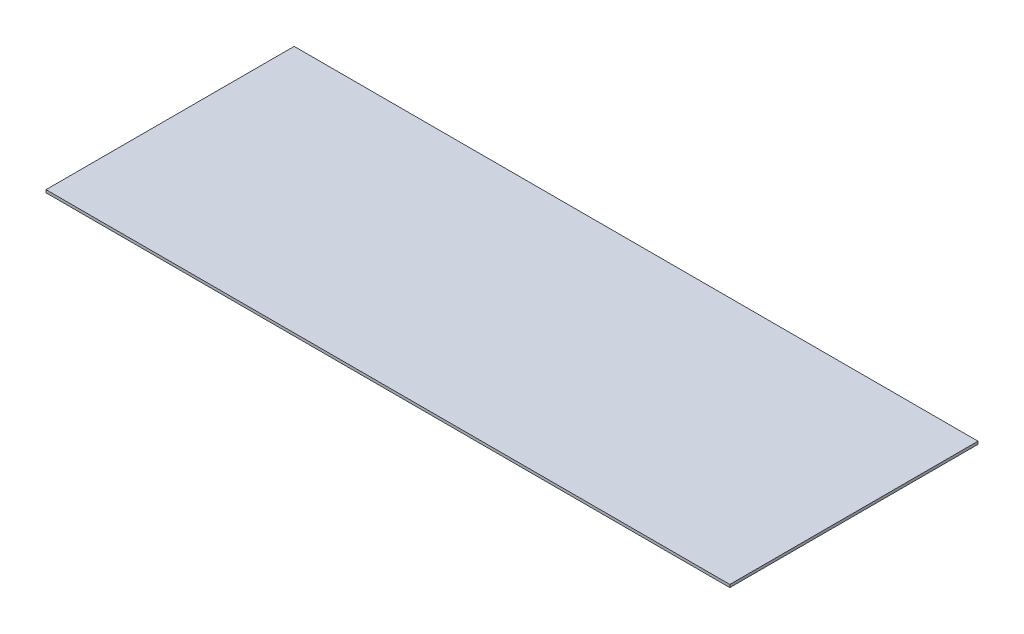
ISO-10303-21;
HEADER;
FILE_DESCRIPTION(('STEP AP214'),'2;1');
FILE_NAME('part.step','',(''),(''),'','','');
FILE_SCHEMA(('AUTOMOTIVE_DESIGN { 1 0 10303 214 1 1 1 1 }'));
ENDSEC;
DATA;
#1=APPLICATION_CONTEXT('core data for automotive mechanical design processes');
#2=APPLICATION_PROTOCOL_DEFINITION('international standard','automotive_design',2000,#1);
#3=PRODUCT_CONTEXT('',#1,'mechanical');
#4=PRODUCT('Part','Part','',(#3));
#5=PRODUCT_RELATED_PRODUCT_CATEGORY('part','',(#4));
#6=PRODUCT_DEFINITION_FORMATION('','',#4);
#7=PRODUCT_DEFINITION_CONTEXT('part definition',#1,'design');
#8=PRODUCT_DEFINITION('design','',#6,#7);
#9=PRODUCT_DEFINITION_SHAPE('','',#8);
#10=(LENGTH_UNIT() NAMED_UNIT(*) SI_UNIT(.MILLI.,.METRE.));
#11=(NAMED_UNIT(*) PLANE_ANGLE_UNIT() SI_UNIT($,.RADIAN.));
#12=(NAMED_UNIT(*) SI_UNIT($,.STERADIAN.) SOLID_ANGLE_UNIT());
#13=UNCERTAINTY_MEASURE_WITH_UNIT(LENGTH_MEASURE(1.E-05),#10,'distance_accuracy_value','');
#14=(GEOMETRIC_REPRESENTATION_CONTEXT(3) GLOBAL_UNCERTAINTY_ASSIGNED_CONTEXT((#13)) GLOBAL_UNIT_ASSIGNED_CONTEXT((#10,
#11,#12)) REPRESENTATION_CONTEXT('',''));
#15=CARTESIAN_POINT('',(0.,0.,0.));
#16=DIRECTION('',(0.,0.,1.));
#17=DIRECTION('',(1.,0.,0.));
#18=AXIS2_PLACEMENT_3D('',#15,#16,#17);
#19=CARTESIAN_POINT('',(-256.013393359467,248.,90.));
#20=DIRECTION('',(0.,1.,0.));
#21=DIRECTION('',(0.,0.,1.));
#22=AXIS2_PLACEMENT_3D('',#19,#20,#21);
#23=PLANE('',#22);
#24=DIRECTION('',(1.,0.,0.));
#25=VECTOR('',#24,1.);
#26=CARTESIAN_POINT('',(-250.,248.,90.));
#27=LINE('',#26,#25);
#28=CARTESIAN_POINT('',(-248.,248.,90.));
#29=VERTEX_POINT('',#28);
#30=CARTESIAN_POINT('',(248.,248.,90.));
#31=VERTEX_POINT('',#30);
#32=EDGE_CURVE('E86',#29,#31,#27,.T.);
#33=ORIENTED_EDGE('',*,*,#32,.F.);
#34=DIRECTION('',(0.,0.,1.));
#35=VECTOR('',#34,1.);
#36=CARTESIAN_POINT('',(-248.,248.,0.));
#37=LINE('',#36,#35);
#38=CARTESIAN_POINT('',(-248.,248.,-90.));
#39=VERTEX_POINT('',#38);
#40=EDGE_CURVE('E41',#39,#29,#37,.T.);
#41=ORIENTED_EDGE('',*,*,#40,.F.);
#42=DIRECTION('',(-1.,0.,0.));
#43=VECTOR('',#42,1.);
#44=CARTESIAN_POINT('',(-250.,248.,-90.));
#45=LINE('',#44,#43);
#46=CARTESIAN_POINT('',(248.,248.,-90.));
#47=VERTEX_POINT('',#46);
#48=EDGE_CURVE('E83',#47,#39,#45,.T.);
#49=ORIENTED_EDGE('',*,*,#48,.F.);
#50=DIRECTION('',(0.,0.,-1.));
#51=VECTOR('',#50,1.);
#52=CARTESIAN_POINT('',(248.,248.,0.));
#53=LINE('',#52,#51);
#54=EDGE_CURVE('E11',#31,#47,#53,.T.);
#55=ORIENTED_EDGE('',*,*,#54,.F.);
#56=EDGE_LOOP('',(#33,#41,#49,#55));
#57=FACE_BOUND('',#56,.T.);
#58=ADVANCED_FACE('F32',(#57),#23,.F.);
#59=CARTESIAN_POINT('',(0.,250.,0.));
#60=DIRECTION('',(0.,-1.,0.));
#61=DIRECTION('',(0.,0.,-1.));
#62=AXIS2_PLACEMENT_3D('',#59,#60,#61);
#63=PLANE('',#62);
#64=DIRECTION('',(-1.,0.,0.));
#65=VECTOR('',#64,1.);
#66=CARTESIAN_POINT('',(-250.,250.,-90.));
#67=LINE('',#66,#65);
#68=CARTESIAN_POINT('',(248.,250.,-90.));
#69=VERTEX_POINT('',#68);
#70=CARTESIAN_POINT('',(-248.,250.,-90.));
#71=VERTEX_POINT('',#70);
#72=EDGE_CURVE('E89',#69,#71,#67,.T.);
#73=ORIENTED_EDGE('',*,*,#72,.T.);
#74=DIRECTION('',(0.,0.,1.));
#75=VECTOR('',#74,1.);
#76=CARTESIAN_POINT('',(-248.,250.,0.));
#77=LINE('',#76,#75);
#78=CARTESIAN_POINT('',(-248.,250.,90.));
#79=VERTEX_POINT('',#78);
#80=EDGE_CURVE('E56',#71,#79,#77,.T.);
#81=ORIENTED_EDGE('',*,*,#80,.T.);
#82=DIRECTION('',(1.,0.,0.));
#83=VECTOR('',#82,1.);
#84=CARTESIAN_POINT('',(-250.,250.,90.));
#85=LINE('',#84,#83);
#86=CARTESIAN_POINT('',(248.,250.,90.));
#87=VERTEX_POINT('',#86);
#88=EDGE_CURVE('E99',#79,#87,#85,.T.);
#89=ORIENTED_EDGE('',*,*,#88,.T.);
#90=DIRECTION('',(0.,0.,-1.));
#91=VECTOR('',#90,1.);
#92=CARTESIAN_POINT('',(248.,250.,0.));
#93=LINE('',#92,#91);
#94=EDGE_CURVE('E98',#87,#69,#93,.T.);
#95=ORIENTED_EDGE('',*,*,#94,.T.);
#96=EDGE_LOOP('',(#73,#81,#89,#95));
#97=FACE_BOUND('',#96,.T.);
#98=ADVANCED_FACE('F106',(#97),#63,.F.);
#99=CARTESIAN_POINT('',(248.,250.,-133.832293437024));
#100=DIRECTION('',(-1.,0.,0.));
#101=DIRECTION('',(0.,0.,1.));
#102=AXIS2_PLACEMENT_3D('',#99,#100,#101);
#103=PLANE('',#102);
#104=DIRECTION('',(0.,1.,0.));
#105=VECTOR('',#104,1.);
#106=CARTESIAN_POINT('',(248.,250.,90.));
#107=LINE('',#106,#105);
#108=EDGE_CURVE('E36',#31,#87,#107,.T.);
#109=ORIENTED_EDGE('',*,*,#108,.F.);
#110=ORIENTED_EDGE('',*,*,#54,.T.);
#111=DIRECTION('',(0.,-1.,0.));
#112=VECTOR('',#111,1.);
#113=CARTESIAN_POINT('',(248.,250.,-90.));
#114=LINE('',#113,#112);
#115=EDGE_CURVE('E78',#69,#47,#114,.T.);
#116=ORIENTED_EDGE('',*,*,#115,.F.);
#117=ORIENTED_EDGE('',*,*,#94,.F.);
#118=EDGE_LOOP('',(#109,#110,#116,#117));
#119=FACE_BOUND('',#118,.T.);
#120=ADVANCED_FACE('F76',(#119),#103,.F.);
#121=CARTESIAN_POINT('',(-248.,250.,-133.832293437024));
#122=DIRECTION('',(1.,0.,0.));
#123=DIRECTION('',(0.,0.,-1.));
#124=AXIS2_PLACEMENT_3D('',#121,#122,#123);
#125=PLANE('',#124);
#126=DIRECTION('',(0.,1.,0.));
#127=VECTOR('',#126,1.);
#128=CARTESIAN_POINT('',(-248.,250.,-90.));
#129=LINE('',#128,#127);
#130=EDGE_CURVE('E90',#39,#71,#129,.T.);
#131=ORIENTED_EDGE('',*,*,#130,.F.);
#132=ORIENTED_EDGE('',*,*,#40,.T.);
#133=DIRECTION('',(0.,-1.,0.));
#134=VECTOR('',#133,1.);
#135=CARTESIAN_POINT('',(-248.,250.,90.));
#136=LINE('',#135,#134);
#137=EDGE_CURVE('E91',#79,#29,#136,.T.);
#138=ORIENTED_EDGE('',*,*,#137,.F.);
#139=ORIENTED_EDGE('',*,*,#80,.F.);
#140=EDGE_LOOP('',(#131,#132,#138,#139));
#141=FACE_BOUND('',#140,.T.);
#142=ADVANCED_FACE('F104',(#141),#125,.F.);
#143=CARTESIAN_POINT('',(-250.,250.,90.));
#144=DIRECTION('',(0.,0.,-1.));
#145=DIRECTION('',(-1.,0.,0.));
#146=AXIS2_PLACEMENT_3D('',#143,#144,#145);
#147=PLANE('',#146);
#148=ORIENTED_EDGE('',*,*,#137,.T.);
#149=ORIENTED_EDGE('',*,*,#32,.T.);
#150=ORIENTED_EDGE('',*,*,#108,.T.);
#151=ORIENTED_EDGE('',*,*,#88,.F.);
#152=EDGE_LOOP('',(#148,#149,#150,#151));
#153=FACE_BOUND('',#152,.T.);
#154=ADVANCED_FACE('F105',(#153),#147,.F.);
#155=CARTESIAN_POINT('',(-250.,250.,-90.));
#156=DIRECTION('',(0.,0.,1.));
#157=DIRECTION('',(1.,0.,0.));
#158=AXIS2_PLACEMENT_3D('',#155,#156,#157);
#159=PLANE('',#158);
#160=ORIENTED_EDGE('',*,*,#115,.T.);
#161=ORIENTED_EDGE('',*,*,#48,.T.);
#162=ORIENTED_EDGE('',*,*,#130,.T.);
#163=ORIENTED_EDGE('',*,*,#72,.F.);
#164=EDGE_LOOP('',(#160,#161,#162,#163));
#165=FACE_BOUND('',#164,.T.);
#166=ADVANCED_FACE('F34',(#165),#159,.F.);
#167=CLOSED_SHELL('',(#58,#98,#120,#142,#154,#166));
#168=MANIFOLD_SOLID_BREP('B2',#167);
#169=ADVANCED_BREP_SHAPE_REPRESENTATION('',(#18,#168),#14);
#170=SHAPE_DEFINITION_REPRESENTATION(#9,#169);
ENDSEC;
END-ISO-10303-21;
